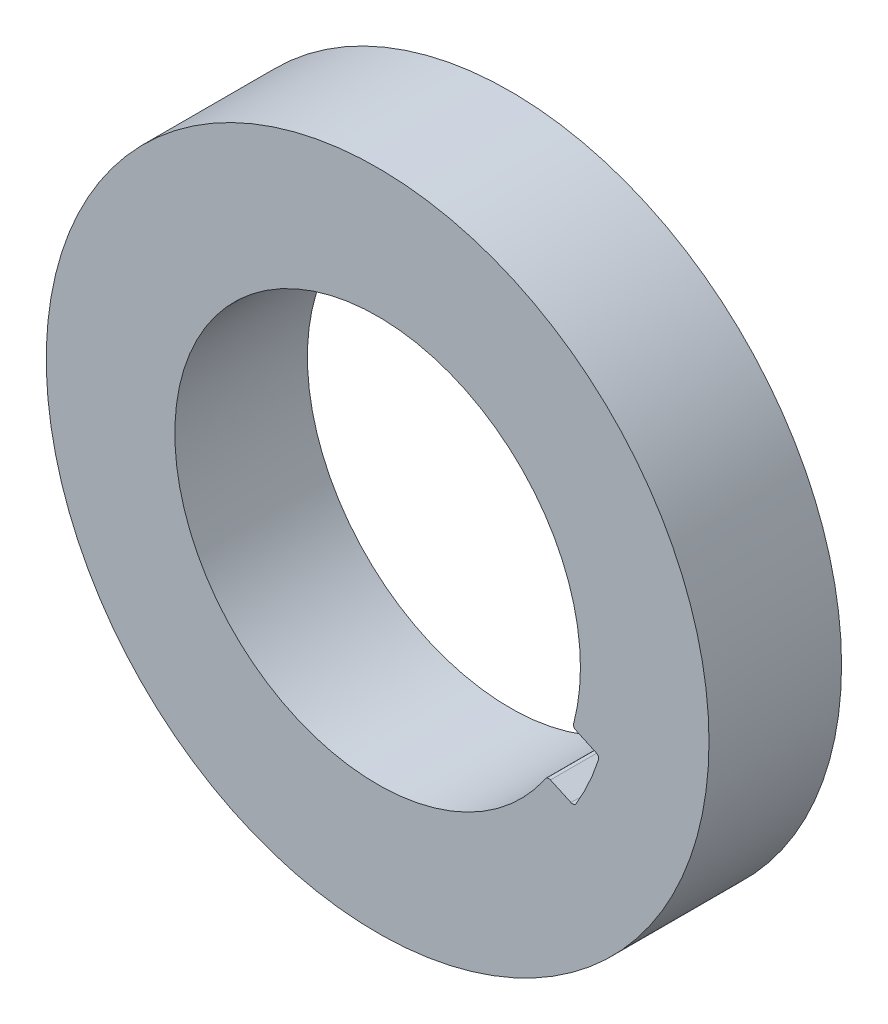
ISO-10303-21;
HEADER;
FILE_DESCRIPTION(('STEP AP214'),'2;1');
FILE_NAME('part.step','',(''),(''),'','','');
FILE_SCHEMA(('AUTOMOTIVE_DESIGN { 1 0 10303 214 1 1 1 1 }'));
ENDSEC;
DATA;
#1=APPLICATION_CONTEXT('core data for automotive mechanical design processes');
#2=APPLICATION_PROTOCOL_DEFINITION('international standard','automotive_design',2000,#1);
#3=PRODUCT_CONTEXT('',#1,'mechanical');
#4=PRODUCT('Part','Part','',(#3));
#5=PRODUCT_RELATED_PRODUCT_CATEGORY('part','',(#4));
#6=PRODUCT_DEFINITION_FORMATION('','',#4);
#7=PRODUCT_DEFINITION_CONTEXT('part definition',#1,'design');
#8=PRODUCT_DEFINITION('design','',#6,#7);
#9=PRODUCT_DEFINITION_SHAPE('','',#8);
#10=(LENGTH_UNIT() NAMED_UNIT(*) SI_UNIT(.MILLI.,.METRE.));
#11=(NAMED_UNIT(*) PLANE_ANGLE_UNIT() SI_UNIT($,.RADIAN.));
#12=(NAMED_UNIT(*) SI_UNIT($,.STERADIAN.) SOLID_ANGLE_UNIT());
#13=UNCERTAINTY_MEASURE_WITH_UNIT(LENGTH_MEASURE(1.E-05),#10,'distance_accuracy_value','');
#14=(GEOMETRIC_REPRESENTATION_CONTEXT(3) GLOBAL_UNCERTAINTY_ASSIGNED_CONTEXT((#13)) GLOBAL_UNIT_ASSIGNED_CONTEXT((#10,
#11,#12)) REPRESENTATION_CONTEXT('',''));
#15=CARTESIAN_POINT('',(0.,0.,0.));
#16=DIRECTION('',(0.,0.,1.));
#17=DIRECTION('',(1.,0.,0.));
#18=AXIS2_PLACEMENT_3D('',#15,#16,#17);
#19=CARTESIAN_POINT('',(0.,0.,10.));
#20=DIRECTION('',(0.,0.,1.));
#21=DIRECTION('',(1.,0.,0.));
#22=AXIS2_PLACEMENT_3D('',#19,#20,#21);
#23=PLANE('',#22);
#24=CARTESIAN_POINT('',(0.,0.,10.));
#25=DIRECTION('',(0.,0.,1.));
#26=DIRECTION('',(1.,0.,0.));
#27=AXIS2_PLACEMENT_3D('',#24,#25,#26);
#28=CIRCLE('',#27,25.);
#29=CARTESIAN_POINT('',(25.,0.,10.));
#30=VERTEX_POINT('',#29);
#31=EDGE_CURVE('E11',#30,#30,#28,.T.);
#32=ORIENTED_EDGE('',*,*,#31,.T.);
#33=EDGE_LOOP('',(#32));
#34=FACE_BOUND('',#33,.T.);
#35=CARTESIAN_POINT('',(0.,0.,10.));
#36=DIRECTION('',(0.,0.,1.));
#37=DIRECTION('',(-1.,0.,0.));
#38=AXIS2_PLACEMENT_3D('',#35,#36,#37);
#39=CIRCLE('',#38,15.3);
#40=CARTESIAN_POINT('',(14.7874090005765,-3.92715355565187,10.));
#41=VERTEX_POINT('',#40);
#42=CARTESIAN_POINT('',(12.665533257958,-8.58337155735204,10.));
#43=VERTEX_POINT('',#42);
#44=EDGE_CURVE('E105',#41,#43,#39,.T.);
#45=ORIENTED_EDGE('',*,*,#44,.F.);
#46=CARTESIAN_POINT('',(15.0773581966662,-4.00415656654701,10.));
#47=DIRECTION('',(0.,0.,-1.));
#48=DIRECTION('',(-1.,0.,0.));
#49=AXIS2_PLACEMENT_3D('',#46,#47,#48);
#50=CIRCLE('',#49,0.299999999999999);
#51=CARTESIAN_POINT('',(14.9530306261464,-4.27718157494119,10.));
#52=VERTEX_POINT('',#51);
#53=EDGE_CURVE('E97',#52,#41,#50,.T.);
#54=ORIENTED_EDGE('',*,*,#53,.F.);
#55=DIRECTION('',(-0.910083361313929,0.414425235066037,0.));
#56=VECTOR('',#55,1.);
#57=CARTESIAN_POINT('',(14.9530306261464,-4.27718157494119,10.));
#58=LINE('',#57,#56);
#59=CARTESIAN_POINT('',(16.5017580420231,-4.98242655651217,10.));
#60=VERTEX_POINT('',#59);
#61=EDGE_CURVE('E129',#60,#52,#58,.T.);
#62=ORIENTED_EDGE('',*,*,#61,.F.);
#63=CARTESIAN_POINT('',(16.3774304715033,-5.25545156490635,10.));
#64=DIRECTION('',(0.,0.,1.));
#65=DIRECTION('',(1.,0.,0.));
#66=AXIS2_PLACEMENT_3D('',#63,#64,#65);
#67=CIRCLE('',#66,0.300000000000004);
#68=CARTESIAN_POINT('',(16.6630833285644,-5.34711641778262,10.));
#69=VERTEX_POINT('',#68);
#70=EDGE_CURVE('E127',#69,#60,#67,.T.);
#71=ORIENTED_EDGE('',*,*,#70,.F.);
#72=CARTESIAN_POINT('',(0.,0.,10.));
#73=DIRECTION('',(0.,0.,1.));
#74=DIRECTION('',(-1.,0.,0.));
#75=AXIS2_PLACEMENT_3D('',#72,#73,#74);
#76=CIRCLE('',#75,17.5);
#77=CARTESIAN_POINT('',(14.9680088952146,-9.06690188061927,10.));
#78=VERTEX_POINT('',#77);
#79=EDGE_CURVE('E125',#78,#69,#76,.T.);
#80=ORIENTED_EDGE('',*,*,#79,.F.);
#81=CARTESIAN_POINT('',(14.7114144570109,-8.91146927695151,10.));
#82=DIRECTION('',(0.,0.,1.));
#83=DIRECTION('',(1.,0.,0.));
#84=AXIS2_PLACEMENT_3D('',#81,#82,#83);
#85=CIRCLE('',#84,0.300000000000001);
#86=CARTESIAN_POINT('',(14.5870093966954,-9.18445898548995,10.));
#87=VERTEX_POINT('',#86);
#88=EDGE_CURVE('E123',#87,#78,#85,.T.);
#89=ORIENTED_EDGE('',*,*,#88,.F.);
#90=DIRECTION('',(0.909965695128138,-0.414683534384915,0.));
#91=VECTOR('',#90,1.);
#92=CARTESIAN_POINT('',(13.0382821076452,-8.47868325189894,10.));
#93=LINE('',#92,#91);
#94=CARTESIAN_POINT('',(13.0382821076452,-8.47868325189894,10.));
#95=VERTEX_POINT('',#94);
#96=EDGE_CURVE('E119',#95,#87,#93,.T.);
#97=ORIENTED_EDGE('',*,*,#96,.F.);
#98=CARTESIAN_POINT('',(12.9138770473297,-8.75167296043738,10.));
#99=DIRECTION('',(0.,0.,-1.));
#100=DIRECTION('',(1.,0.,0.));
#101=AXIS2_PLACEMENT_3D('',#98,#99,#100);
#102=CIRCLE('',#101,0.299999999999998);
#103=EDGE_CURVE('E117',#43,#95,#102,.T.);
#104=ORIENTED_EDGE('',*,*,#103,.F.);
#105=EDGE_LOOP('',(#45,#54,#62,#71,#80,#89,#97,#104));
#106=FACE_BOUND('',#105,.T.);
#107=ADVANCED_FACE('F32',(#34,#106),#23,.T.);
#108=CARTESIAN_POINT('',(0.,0.,0.));
#109=DIRECTION('',(0.,0.,1.));
#110=DIRECTION('',(1.,0.,0.));
#111=AXIS2_PLACEMENT_3D('',#108,#109,#110);
#112=PLANE('',#111);
#113=CARTESIAN_POINT('',(0.,0.,0.));
#114=DIRECTION('',(0.,0.,1.));
#115=DIRECTION('',(1.,0.,0.));
#116=AXIS2_PLACEMENT_3D('',#113,#114,#115);
#117=CIRCLE('',#116,25.);
#118=CARTESIAN_POINT('',(25.,0.,0.));
#119=VERTEX_POINT('',#118);
#120=EDGE_CURVE('E36',#119,#119,#117,.T.);
#121=ORIENTED_EDGE('',*,*,#120,.F.);
#122=EDGE_LOOP('',(#121));
#123=FACE_BOUND('',#122,.T.);
#124=CARTESIAN_POINT('',(15.0773581966662,-4.00415656654701,0.));
#125=DIRECTION('',(0.,0.,-1.));
#126=DIRECTION('',(-1.,0.,0.));
#127=AXIS2_PLACEMENT_3D('',#124,#125,#126);
#128=CIRCLE('',#127,0.299999999999999);
#129=CARTESIAN_POINT('',(14.9530306261464,-4.27718157494119,0.));
#130=VERTEX_POINT('',#129);
#131=CARTESIAN_POINT('',(14.7874090005765,-3.92715355565187,0.));
#132=VERTEX_POINT('',#131);
#133=EDGE_CURVE('E55',#130,#132,#128,.T.);
#134=ORIENTED_EDGE('',*,*,#133,.T.);
#135=CARTESIAN_POINT('',(0.,0.,0.));
#136=DIRECTION('',(0.,0.,1.));
#137=DIRECTION('',(-1.,0.,0.));
#138=AXIS2_PLACEMENT_3D('',#135,#136,#137);
#139=CIRCLE('',#138,15.3);
#140=CARTESIAN_POINT('',(12.665533257958,-8.58337155735204,0.));
#141=VERTEX_POINT('',#140);
#142=EDGE_CURVE('E112',#132,#141,#139,.T.);
#143=ORIENTED_EDGE('',*,*,#142,.T.);
#144=CARTESIAN_POINT('',(12.9138770473297,-8.75167296043738,0.));
#145=DIRECTION('',(0.,0.,-1.));
#146=DIRECTION('',(1.,0.,0.));
#147=AXIS2_PLACEMENT_3D('',#144,#145,#146);
#148=CIRCLE('',#147,0.299999999999998);
#149=CARTESIAN_POINT('',(13.0382821076452,-8.47868325189894,0.));
#150=VERTEX_POINT('',#149);
#151=EDGE_CURVE('E133',#141,#150,#148,.T.);
#152=ORIENTED_EDGE('',*,*,#151,.T.);
#153=DIRECTION('',(0.909965695128138,-0.414683534384915,0.));
#154=VECTOR('',#153,1.);
#155=CARTESIAN_POINT('',(13.0382821076452,-8.47868325189894,0.));
#156=LINE('',#155,#154);
#157=CARTESIAN_POINT('',(14.5870093966954,-9.18445898548995,0.));
#158=VERTEX_POINT('',#157);
#159=EDGE_CURVE('E136',#150,#158,#156,.T.);
#160=ORIENTED_EDGE('',*,*,#159,.T.);
#161=CARTESIAN_POINT('',(14.7114144570109,-8.91146927695151,0.));
#162=DIRECTION('',(0.,0.,1.));
#163=DIRECTION('',(1.,0.,0.));
#164=AXIS2_PLACEMENT_3D('',#161,#162,#163);
#165=CIRCLE('',#164,0.300000000000001);
#166=CARTESIAN_POINT('',(14.9680088952146,-9.06690188061927,0.));
#167=VERTEX_POINT('',#166);
#168=EDGE_CURVE('E139',#158,#167,#165,.T.);
#169=ORIENTED_EDGE('',*,*,#168,.T.);
#170=CARTESIAN_POINT('',(0.,0.,0.));
#171=DIRECTION('',(0.,0.,1.));
#172=DIRECTION('',(-1.,0.,0.));
#173=AXIS2_PLACEMENT_3D('',#170,#171,#172);
#174=CIRCLE('',#173,17.5);
#175=CARTESIAN_POINT('',(16.6630833285644,-5.34711641778262,0.));
#176=VERTEX_POINT('',#175);
#177=EDGE_CURVE('E142',#167,#176,#174,.T.);
#178=ORIENTED_EDGE('',*,*,#177,.T.);
#179=CARTESIAN_POINT('',(16.3774304715033,-5.25545156490635,0.));
#180=DIRECTION('',(0.,0.,1.));
#181=DIRECTION('',(1.,0.,0.));
#182=AXIS2_PLACEMENT_3D('',#179,#180,#181);
#183=CIRCLE('',#182,0.300000000000004);
#184=CARTESIAN_POINT('',(16.5017580420231,-4.98242655651217,0.));
#185=VERTEX_POINT('',#184);
#186=EDGE_CURVE('E145',#176,#185,#183,.T.);
#187=ORIENTED_EDGE('',*,*,#186,.T.);
#188=DIRECTION('',(-0.910083361313929,0.414425235066037,0.));
#189=VECTOR('',#188,1.);
#190=CARTESIAN_POINT('',(14.9530306261464,-4.27718157494119,0.));
#191=LINE('',#190,#189);
#192=EDGE_CURVE('E106',#185,#130,#191,.T.);
#193=ORIENTED_EDGE('',*,*,#192,.T.);
#194=EDGE_LOOP('',(#134,#143,#152,#160,#169,#178,#187,#193));
#195=FACE_BOUND('',#194,.T.);
#196=ADVANCED_FACE('F166',(#123,#195),#112,.F.);
#197=CARTESIAN_POINT('',(0.,0.,10.));
#198=DIRECTION('',(0.,0.,-1.));
#199=DIRECTION('',(-1.,0.,0.));
#200=AXIS2_PLACEMENT_3D('',#197,#198,#199);
#201=CYLINDRICAL_SURFACE('',#200,25.);
#202=ORIENTED_EDGE('',*,*,#31,.F.);
#203=EDGE_LOOP('',(#202));
#204=FACE_BOUND('',#203,.T.);
#205=ORIENTED_EDGE('',*,*,#120,.T.);
#206=EDGE_LOOP('',(#205));
#207=FACE_BOUND('',#206,.T.);
#208=ADVANCED_FACE('F34',(#204,#207),#201,.T.);
#209=CARTESIAN_POINT('',(15.0773581966662,-4.00415656654701,10.));
#210=DIRECTION('',(0.,0.,-1.));
#211=DIRECTION('',(-1.,0.,0.));
#212=AXIS2_PLACEMENT_3D('',#209,#210,#211);
#213=CYLINDRICAL_SURFACE('',#212,0.299999999999999);
#214=ORIENTED_EDGE('',*,*,#133,.F.);
#215=DIRECTION('',(0.,0.,-1.));
#216=VECTOR('',#215,1.);
#217=CARTESIAN_POINT('',(14.9530306261464,-4.27718157494119,10.));
#218=LINE('',#217,#216);
#219=EDGE_CURVE('E101',#52,#130,#218,.T.);
#220=ORIENTED_EDGE('',*,*,#219,.F.);
#221=ORIENTED_EDGE('',*,*,#53,.T.);
#222=DIRECTION('',(0.,0.,-1.));
#223=VECTOR('',#222,1.);
#224=CARTESIAN_POINT('',(14.7874090005765,-3.92715355565187,10.));
#225=LINE('',#224,#223);
#226=EDGE_CURVE('E100',#41,#132,#225,.T.);
#227=ORIENTED_EDGE('',*,*,#226,.T.);
#228=EDGE_LOOP('',(#214,#220,#221,#227));
#229=FACE_BOUND('',#228,.T.);
#230=ADVANCED_FACE('F99',(#229),#213,.T.);
#231=CARTESIAN_POINT('',(0.,0.,10.));
#232=DIRECTION('',(0.,0.,-1.));
#233=DIRECTION('',(-1.,0.,0.));
#234=AXIS2_PLACEMENT_3D('',#231,#232,#233);
#235=CYLINDRICAL_SURFACE('',#234,15.3);
#236=ORIENTED_EDGE('',*,*,#142,.F.);
#237=ORIENTED_EDGE('',*,*,#226,.F.);
#238=ORIENTED_EDGE('',*,*,#44,.T.);
#239=DIRECTION('',(0.,0.,-1.));
#240=VECTOR('',#239,1.);
#241=CARTESIAN_POINT('',(12.665533257958,-8.58337155735204,10.));
#242=LINE('',#241,#240);
#243=EDGE_CURVE('E113',#43,#141,#242,.T.);
#244=ORIENTED_EDGE('',*,*,#243,.T.);
#245=EDGE_LOOP('',(#236,#237,#238,#244));
#246=FACE_BOUND('',#245,.T.);
#247=ADVANCED_FACE('F109',(#246),#235,.F.);
#248=CARTESIAN_POINT('',(12.9138770473297,-8.75167296043738,10.));
#249=DIRECTION('',(0.,0.,-1.));
#250=DIRECTION('',(-1.,0.,0.));
#251=AXIS2_PLACEMENT_3D('',#248,#249,#250);
#252=CYLINDRICAL_SURFACE('',#251,0.299999999999998);
#253=ORIENTED_EDGE('',*,*,#151,.F.);
#254=ORIENTED_EDGE('',*,*,#243,.F.);
#255=ORIENTED_EDGE('',*,*,#103,.T.);
#256=DIRECTION('',(0.,0.,-1.));
#257=VECTOR('',#256,1.);
#258=CARTESIAN_POINT('',(13.0382821076452,-8.47868325189894,10.));
#259=LINE('',#258,#257);
#260=EDGE_CURVE('E158',#95,#150,#259,.T.);
#261=ORIENTED_EDGE('',*,*,#260,.T.);
#262=EDGE_LOOP('',(#253,#254,#255,#261));
#263=FACE_BOUND('',#262,.T.);
#264=ADVANCED_FACE('F162',(#263),#252,.T.);
#265=CARTESIAN_POINT('',(13.0382821076452,-8.47868325189894,10.));
#266=DIRECTION('',(0.414683534384915,0.909965695128138,0.));
#267=DIRECTION('',(-0.909965695128138,0.414683534384915,0.));
#268=AXIS2_PLACEMENT_3D('',#265,#266,#267);
#269=PLANE('',#268);
#270=ORIENTED_EDGE('',*,*,#159,.F.);
#271=ORIENTED_EDGE('',*,*,#260,.F.);
#272=ORIENTED_EDGE('',*,*,#96,.T.);
#273=DIRECTION('',(0.,0.,-1.));
#274=VECTOR('',#273,1.);
#275=CARTESIAN_POINT('',(14.5870093966954,-9.18445898548995,10.));
#276=LINE('',#275,#274);
#277=EDGE_CURVE('E156',#87,#158,#276,.T.);
#278=ORIENTED_EDGE('',*,*,#277,.T.);
#279=EDGE_LOOP('',(#270,#271,#272,#278));
#280=FACE_BOUND('',#279,.T.);
#281=ADVANCED_FACE('F184',(#280),#269,.T.);
#282=CARTESIAN_POINT('',(14.7114144570109,-8.91146927695151,10.));
#283=DIRECTION('',(0.,0.,-1.));
#284=DIRECTION('',(-1.,0.,0.));
#285=AXIS2_PLACEMENT_3D('',#282,#283,#284);
#286=CYLINDRICAL_SURFACE('',#285,0.300000000000001);
#287=ORIENTED_EDGE('',*,*,#168,.F.);
#288=ORIENTED_EDGE('',*,*,#277,.F.);
#289=ORIENTED_EDGE('',*,*,#88,.T.);
#290=DIRECTION('',(0.,0.,-1.));
#291=VECTOR('',#290,1.);
#292=CARTESIAN_POINT('',(14.9680088952146,-9.06690188061927,10.));
#293=LINE('',#292,#291);
#294=EDGE_CURVE('E154',#78,#167,#293,.T.);
#295=ORIENTED_EDGE('',*,*,#294,.T.);
#296=EDGE_LOOP('',(#287,#288,#289,#295));
#297=FACE_BOUND('',#296,.T.);
#298=ADVANCED_FACE('F181',(#297),#286,.F.);
#299=CARTESIAN_POINT('',(0.,0.,10.));
#300=DIRECTION('',(0.,0.,-1.));
#301=DIRECTION('',(-1.,0.,0.));
#302=AXIS2_PLACEMENT_3D('',#299,#300,#301);
#303=CYLINDRICAL_SURFACE('',#302,17.5);
#304=ORIENTED_EDGE('',*,*,#177,.F.);
#305=ORIENTED_EDGE('',*,*,#294,.F.);
#306=ORIENTED_EDGE('',*,*,#79,.T.);
#307=DIRECTION('',(0.,0.,-1.));
#308=VECTOR('',#307,1.);
#309=CARTESIAN_POINT('',(16.6630833285644,-5.34711641778262,10.));
#310=LINE('',#309,#308);
#311=EDGE_CURVE('E152',#69,#176,#310,.T.);
#312=ORIENTED_EDGE('',*,*,#311,.T.);
#313=EDGE_LOOP('',(#304,#305,#306,#312));
#314=FACE_BOUND('',#313,.T.);
#315=ADVANCED_FACE('F177',(#314),#303,.F.);
#316=CARTESIAN_POINT('',(16.3774304715033,-5.25545156490635,10.));
#317=DIRECTION('',(0.,0.,-1.));
#318=DIRECTION('',(-1.,0.,0.));
#319=AXIS2_PLACEMENT_3D('',#316,#317,#318);
#320=CYLINDRICAL_SURFACE('',#319,0.300000000000004);
#321=ORIENTED_EDGE('',*,*,#186,.F.);
#322=ORIENTED_EDGE('',*,*,#311,.F.);
#323=ORIENTED_EDGE('',*,*,#70,.T.);
#324=DIRECTION('',(0.,0.,-1.));
#325=VECTOR('',#324,1.);
#326=CARTESIAN_POINT('',(16.5017580420231,-4.98242655651217,10.));
#327=LINE('',#326,#325);
#328=EDGE_CURVE('E47',#60,#185,#327,.T.);
#329=ORIENTED_EDGE('',*,*,#328,.T.);
#330=EDGE_LOOP('',(#321,#322,#323,#329));
#331=FACE_BOUND('',#330,.T.);
#332=ADVANCED_FACE('F174',(#331),#320,.F.);
#333=CARTESIAN_POINT('',(14.9530306261464,-4.27718157494119,10.));
#334=DIRECTION('',(-0.414425235066037,-0.910083361313929,0.));
#335=DIRECTION('',(0.910083361313929,-0.414425235066037,0.));
#336=AXIS2_PLACEMENT_3D('',#333,#334,#335);
#337=PLANE('',#336);
#338=ORIENTED_EDGE('',*,*,#192,.F.);
#339=ORIENTED_EDGE('',*,*,#328,.F.);
#340=ORIENTED_EDGE('',*,*,#61,.T.);
#341=ORIENTED_EDGE('',*,*,#219,.T.);
#342=EDGE_LOOP('',(#338,#339,#340,#341));
#343=FACE_BOUND('',#342,.T.);
#344=ADVANCED_FACE('F168',(#343),#337,.T.);
#345=CLOSED_SHELL('',(#107,#196,#208,#230,#247,#264,#281,#298,#315,#332,#344));
#346=MANIFOLD_SOLID_BREP('B2',#345);
#347=ADVANCED_BREP_SHAPE_REPRESENTATION('',(#18,#346),#14);
#348=SHAPE_DEFINITION_REPRESENTATION(#9,#347);
ENDSEC;
END-ISO-10303-21;
